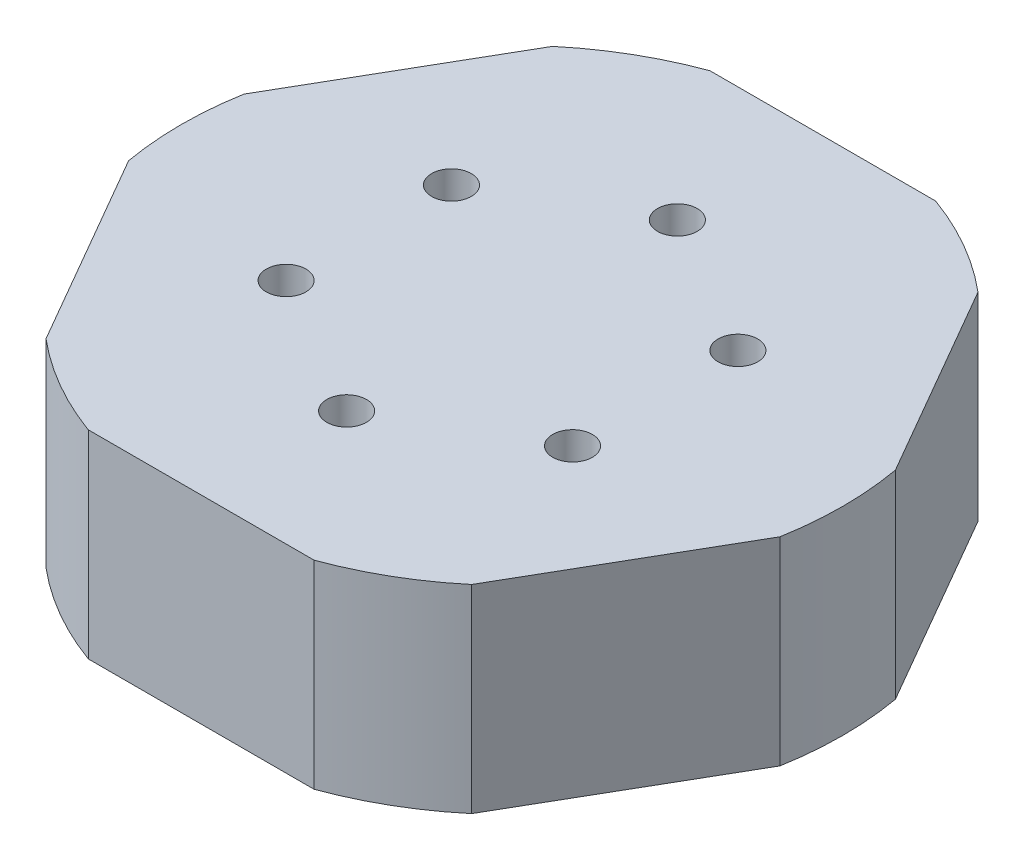
ISO-10303-21;
HEADER;
FILE_DESCRIPTION(('STEP AP214'),'2;1');
FILE_NAME('part.step','',(''),(''),'','','');
FILE_SCHEMA(('AUTOMOTIVE_DESIGN { 1 0 10303 214 1 1 1 1 }'));
ENDSEC;
DATA;
#1=APPLICATION_CONTEXT('core data for automotive mechanical design processes');
#2=APPLICATION_PROTOCOL_DEFINITION('international standard','automotive_design',2000,#1);
#3=PRODUCT_CONTEXT('',#1,'mechanical');
#4=PRODUCT('Part','Part','',(#3));
#5=PRODUCT_RELATED_PRODUCT_CATEGORY('part','',(#4));
#6=PRODUCT_DEFINITION_FORMATION('','',#4);
#7=PRODUCT_DEFINITION_CONTEXT('part definition',#1,'design');
#8=PRODUCT_DEFINITION('design','',#6,#7);
#9=PRODUCT_DEFINITION_SHAPE('','',#8);
#10=(LENGTH_UNIT() NAMED_UNIT(*) SI_UNIT(.MILLI.,.METRE.));
#11=(NAMED_UNIT(*) PLANE_ANGLE_UNIT() SI_UNIT($,.RADIAN.));
#12=(NAMED_UNIT(*) SI_UNIT($,.STERADIAN.) SOLID_ANGLE_UNIT());
#13=UNCERTAINTY_MEASURE_WITH_UNIT(LENGTH_MEASURE(1.E-05),#10,'distance_accuracy_value','');
#14=(GEOMETRIC_REPRESENTATION_CONTEXT(3) GLOBAL_UNCERTAINTY_ASSIGNED_CONTEXT((#13)) GLOBAL_UNIT_ASSIGNED_CONTEXT((#10,
#11,#12)) REPRESENTATION_CONTEXT('',''));
#15=CARTESIAN_POINT('',(0.,0.,0.));
#16=DIRECTION('',(0.,0.,1.));
#17=DIRECTION('',(1.,0.,0.));
#18=AXIS2_PLACEMENT_3D('',#15,#16,#17);
#19=CARTESIAN_POINT('',(0.,10.,0.));
#20=DIRECTION('',(0.,1.,0.));
#21=DIRECTION('',(0.,0.,1.));
#22=AXIS2_PLACEMENT_3D('',#19,#20,#21);
#23=PLANE('',#22);
#24=CARTESIAN_POINT('',(0.,10.,-25.));
#25=DIRECTION('',(0.,1.,0.));
#26=DIRECTION('',(0.,0.,1.));
#27=AXIS2_PLACEMENT_3D('',#24,#25,#26);
#28=CIRCLE('',#27,3.);
#29=CARTESIAN_POINT('',(0.,10.,-22.));
#30=VERTEX_POINT('',#29);
#31=EDGE_CURVE('E274',#30,#30,#28,.T.);
#32=ORIENTED_EDGE('',*,*,#31,.F.);
#33=EDGE_LOOP('',(#32));
#34=FACE_BOUND('',#33,.T.);
#35=CARTESIAN_POINT('',(-21.6506350946108,10.,-12.5000000000003));
#36=DIRECTION('',(0.,1.,0.));
#37=DIRECTION('',(0.,0.,1.));
#38=AXIS2_PLACEMENT_3D('',#35,#36,#37);
#39=CIRCLE('',#38,3.);
#40=CARTESIAN_POINT('',(-21.6506350946108,10.,-9.50000000000025));
#41=VERTEX_POINT('',#40);
#42=EDGE_CURVE('E265',#41,#41,#39,.T.);
#43=ORIENTED_EDGE('',*,*,#42,.F.);
#44=EDGE_LOOP('',(#43));
#45=FACE_BOUND('',#44,.T.);
#46=CARTESIAN_POINT('',(-21.6506350946111,10.,12.4999999999998));
#47=DIRECTION('',(0.,1.,0.));
#48=DIRECTION('',(0.,0.,1.));
#49=AXIS2_PLACEMENT_3D('',#46,#47,#48);
#50=CIRCLE('',#49,3.);
#51=CARTESIAN_POINT('',(-21.6506350946111,10.,15.4999999999998));
#52=VERTEX_POINT('',#51);
#53=EDGE_CURVE('E261',#52,#52,#50,.T.);
#54=ORIENTED_EDGE('',*,*,#53,.F.);
#55=EDGE_LOOP('',(#54));
#56=FACE_BOUND('',#55,.T.);
#57=CARTESIAN_POINT('',(-1.74574066942157E-13,10.,25.));
#58=DIRECTION('',(0.,1.,0.));
#59=DIRECTION('',(0.,0.,1.));
#60=AXIS2_PLACEMENT_3D('',#57,#58,#59);
#61=CIRCLE('',#60,3.);
#62=CARTESIAN_POINT('',(-1.74574066942157E-13,10.,28.));
#63=VERTEX_POINT('',#62);
#64=EDGE_CURVE('E264',#63,#63,#61,.T.);
#65=ORIENTED_EDGE('',*,*,#64,.F.);
#66=EDGE_LOOP('',(#65));
#67=FACE_BOUND('',#66,.T.);
#68=CARTESIAN_POINT('',(21.6506350946109,10.,12.5000000000001));
#69=DIRECTION('',(0.,1.,0.));
#70=DIRECTION('',(0.,0.,1.));
#71=AXIS2_PLACEMENT_3D('',#68,#69,#70);
#72=CIRCLE('',#71,3.);
#73=CARTESIAN_POINT('',(21.6506350946109,10.,15.5000000000001));
#74=VERTEX_POINT('',#73);
#75=EDGE_CURVE('E268',#74,#74,#72,.T.);
#76=ORIENTED_EDGE('',*,*,#75,.F.);
#77=EDGE_LOOP('',(#76));
#78=FACE_BOUND('',#77,.T.);
#79=CARTESIAN_POINT('',(21.650635094611,10.,-12.5));
#80=DIRECTION('',(0.,1.,0.));
#81=DIRECTION('',(0.,0.,1.));
#82=AXIS2_PLACEMENT_3D('',#79,#80,#81);
#83=CIRCLE('',#82,3.);
#84=CARTESIAN_POINT('',(21.650635094611,10.,-9.49999999999995));
#85=VERTEX_POINT('',#84);
#86=EDGE_CURVE('E271',#85,#85,#83,.T.);
#87=ORIENTED_EDGE('',*,*,#86,.F.);
#88=EDGE_LOOP('',(#87));
#89=FACE_BOUND('',#88,.T.);
#90=CARTESIAN_POINT('',(0.,10.,0.));
#91=DIRECTION('',(0.,-1.,0.));
#92=DIRECTION('',(1.,0.,0.));
#93=AXIS2_PLACEMENT_3D('',#90,#91,#92);
#94=CIRCLE('',#93,50.);
#95=CARTESIAN_POINT('',(32.1738329232526,10.,38.2732867026942));
#96=VERTEX_POINT('',#95);
#97=CARTESIAN_POINT('',(17.0587221092319,10.,47.));
#98=VERTEX_POINT('',#97);
#99=EDGE_CURVE('E167',#96,#98,#94,.T.);
#100=ORIENTED_EDGE('',*,*,#99,.F.);
#101=DIRECTION('',(0.5,0.,-0.866025403784439));
#102=VECTOR('',#101,1.);
#103=CARTESIAN_POINT('',(27.1354626519124,10.,47.));
#104=LINE('',#103,#102);
#105=CARTESIAN_POINT('',(49.2325550324846,10.,8.72671329730582));
#106=VERTEX_POINT('',#105);
#107=EDGE_CURVE('E150',#96,#106,#104,.T.);
#108=ORIENTED_EDGE('',*,*,#107,.T.);
#109=CARTESIAN_POINT('',(49.2325550324846,10.,-8.72671329730581));
#110=VERTEX_POINT('',#109);
#111=EDGE_CURVE('E157',#110,#106,#94,.T.);
#112=ORIENTED_EDGE('',*,*,#111,.F.);
#113=DIRECTION('',(-0.5,0.,-0.866025403784439));
#114=VECTOR('',#113,1.);
#115=CARTESIAN_POINT('',(54.2709253038248,10.,0.));
#116=LINE('',#115,#114);
#117=CARTESIAN_POINT('',(32.1738329232526,10.,-38.2732867026942));
#118=VERTEX_POINT('',#117);
#119=EDGE_CURVE('E141',#110,#118,#116,.T.);
#120=ORIENTED_EDGE('',*,*,#119,.T.);
#121=CARTESIAN_POINT('',(17.058722109232,10.,-47.));
#122=VERTEX_POINT('',#121);
#123=EDGE_CURVE('E164',#122,#118,#94,.T.);
#124=ORIENTED_EDGE('',*,*,#123,.F.);
#125=DIRECTION('',(-1.,0.,0.));
#126=VECTOR('',#125,1.);
#127=CARTESIAN_POINT('',(27.1354626519124,10.,-47.));
#128=LINE('',#127,#126);
#129=CARTESIAN_POINT('',(-17.058722109232,10.,-47.));
#130=VERTEX_POINT('',#129);
#131=EDGE_CURVE('E149',#122,#130,#128,.T.);
#132=ORIENTED_EDGE('',*,*,#131,.T.);
#133=CARTESIAN_POINT('',(-32.1738329232526,10.,-38.2732867026942));
#134=VERTEX_POINT('',#133);
#135=EDGE_CURVE('E168',#134,#130,#94,.T.);
#136=ORIENTED_EDGE('',*,*,#135,.F.);
#137=DIRECTION('',(-0.5,0.,0.866025403784439));
#138=VECTOR('',#137,1.);
#139=CARTESIAN_POINT('',(-27.1354626519124,10.,-47.));
#140=LINE('',#139,#138);
#141=CARTESIAN_POINT('',(-49.2325550324846,10.,-8.7267132973058));
#142=VERTEX_POINT('',#141);
#143=EDGE_CURVE('E203',#134,#142,#140,.T.);
#144=ORIENTED_EDGE('',*,*,#143,.T.);
#145=CARTESIAN_POINT('',(-49.2325550324846,10.,8.72671329730581));
#146=VERTEX_POINT('',#145);
#147=EDGE_CURVE('E182',#146,#142,#94,.T.);
#148=ORIENTED_EDGE('',*,*,#147,.F.);
#149=DIRECTION('',(0.5,0.,0.866025403784439));
#150=VECTOR('',#149,1.);
#151=CARTESIAN_POINT('',(-54.2709253038248,10.,0.));
#152=LINE('',#151,#150);
#153=CARTESIAN_POINT('',(-32.1738329232526,10.,38.2732867026942));
#154=VERTEX_POINT('',#153);
#155=EDGE_CURVE('E205',#146,#154,#152,.T.);
#156=ORIENTED_EDGE('',*,*,#155,.T.);
#157=CARTESIAN_POINT('',(-17.058722109232,10.,47.));
#158=VERTEX_POINT('',#157);
#159=EDGE_CURVE('E175',#158,#154,#94,.T.);
#160=ORIENTED_EDGE('',*,*,#159,.F.);
#161=DIRECTION('',(1.,0.,0.));
#162=VECTOR('',#161,1.);
#163=CARTESIAN_POINT('',(-27.1354626519124,10.,47.));
#164=LINE('',#163,#162);
#165=EDGE_CURVE('E211',#158,#98,#164,.T.);
#166=ORIENTED_EDGE('',*,*,#165,.T.);
#167=EDGE_LOOP('',(#100,#108,#112,#120,#124,#132,#136,#144,#148,#156,#160,#166));
#168=FACE_BOUND('',#167,.T.);
#169=ADVANCED_FACE('F52',(#34,#45,#56,#67,#78,#89,#168),#23,.T.);
#170=CARTESIAN_POINT('',(0.,10.,0.));
#171=DIRECTION('',(0.,-1.,0.));
#172=DIRECTION('',(0.,0.,-1.));
#173=AXIS2_PLACEMENT_3D('',#170,#171,#172);
#174=CYLINDRICAL_SURFACE('',#173,50.);
#175=CARTESIAN_POINT('',(0.,-20.,0.));
#176=DIRECTION('',(0.,-1.,0.));
#177=DIRECTION('',(1.,0.,0.));
#178=AXIS2_PLACEMENT_3D('',#175,#176,#177);
#179=CIRCLE('',#178,50.);
#180=CARTESIAN_POINT('',(32.1738329232527,-20.,38.2732867026941));
#181=VERTEX_POINT('',#180);
#182=CARTESIAN_POINT('',(17.0587221092319,-20.,47.));
#183=VERTEX_POINT('',#182);
#184=EDGE_CURVE('E165',#181,#183,#179,.T.);
#185=ORIENTED_EDGE('',*,*,#184,.F.);
#186=DIRECTION('',(0.,-1.,0.));
#187=VECTOR('',#186,1.);
#188=CARTESIAN_POINT('',(32.1738329232526,10.,38.2732867026942));
#189=LINE('',#188,#187);
#190=EDGE_CURVE('E230',#181,#96,#189,.F.);
#191=ORIENTED_EDGE('',*,*,#190,.T.);
#192=ORIENTED_EDGE('',*,*,#99,.T.);
#193=DIRECTION('',(0.,-1.,0.));
#194=VECTOR('',#193,1.);
#195=CARTESIAN_POINT('',(17.0587221092319,10.,47.));
#196=LINE('',#195,#194);
#197=EDGE_CURVE('E224',#98,#183,#196,.T.);
#198=ORIENTED_EDGE('',*,*,#197,.T.);
#199=EDGE_LOOP('',(#185,#191,#192,#198));
#200=FACE_BOUND('',#199,.T.);
#201=ADVANCED_FACE('F255',(#200),#174,.T.);
#202=ORIENTED_EDGE('',*,*,#111,.T.);
#203=DIRECTION('',(0.,-1.,0.));
#204=VECTOR('',#203,1.);
#205=CARTESIAN_POINT('',(49.2325550324846,10.,8.72671329730581));
#206=LINE('',#205,#204);
#207=CARTESIAN_POINT('',(49.2325550324846,-20.,8.72671329730588));
#208=VERTEX_POINT('',#207);
#209=EDGE_CURVE('E228',#106,#208,#206,.T.);
#210=ORIENTED_EDGE('',*,*,#209,.T.);
#211=CARTESIAN_POINT('',(49.2325550324846,-20.,-8.72671329730584));
#212=VERTEX_POINT('',#211);
#213=EDGE_CURVE('E159',#212,#208,#179,.T.);
#214=ORIENTED_EDGE('',*,*,#213,.F.);
#215=DIRECTION('',(0.,-1.,0.));
#216=VECTOR('',#215,1.);
#217=CARTESIAN_POINT('',(49.2325550324846,10.,-8.72671329730581));
#218=LINE('',#217,#216);
#219=EDGE_CURVE('E69',#212,#110,#218,.F.);
#220=ORIENTED_EDGE('',*,*,#219,.T.);
#221=EDGE_LOOP('',(#202,#210,#214,#220));
#222=FACE_BOUND('',#221,.T.);
#223=ADVANCED_FACE('F155',(#222),#174,.T.);
#224=CARTESIAN_POINT('',(-17.058722109232,-20.,47.));
#225=VERTEX_POINT('',#224);
#226=CARTESIAN_POINT('',(-32.1738329232526,-20.,38.2732867026941));
#227=VERTEX_POINT('',#226);
#228=EDGE_CURVE('E170',#225,#227,#179,.T.);
#229=ORIENTED_EDGE('',*,*,#228,.F.);
#230=DIRECTION('',(0.,-1.,0.));
#231=VECTOR('',#230,1.);
#232=CARTESIAN_POINT('',(-17.058722109232,10.,47.));
#233=LINE('',#232,#231);
#234=EDGE_CURVE('E226',#225,#158,#233,.F.);
#235=ORIENTED_EDGE('',*,*,#234,.T.);
#236=ORIENTED_EDGE('',*,*,#159,.T.);
#237=DIRECTION('',(0.,-1.,0.));
#238=VECTOR('',#237,1.);
#239=CARTESIAN_POINT('',(-32.1738329232526,10.,38.2732867026942));
#240=LINE('',#239,#238);
#241=EDGE_CURVE('E220',#154,#227,#240,.T.);
#242=ORIENTED_EDGE('',*,*,#241,.T.);
#243=EDGE_LOOP('',(#229,#235,#236,#242));
#244=FACE_BOUND('',#243,.T.);
#245=ADVANCED_FACE('F249',(#244),#174,.T.);
#246=CARTESIAN_POINT('',(-49.2325550324846,-20.,8.72671329730587));
#247=VERTEX_POINT('',#246);
#248=CARTESIAN_POINT('',(-49.2325550324846,-20.,-8.72671329730586));
#249=VERTEX_POINT('',#248);
#250=EDGE_CURVE('E239',#247,#249,#179,.T.);
#251=ORIENTED_EDGE('',*,*,#250,.F.);
#252=DIRECTION('',(0.,-1.,0.));
#253=VECTOR('',#252,1.);
#254=CARTESIAN_POINT('',(-49.2325550324846,10.,8.72671329730581));
#255=LINE('',#254,#253);
#256=EDGE_CURVE('E222',#247,#146,#255,.F.);
#257=ORIENTED_EDGE('',*,*,#256,.T.);
#258=ORIENTED_EDGE('',*,*,#147,.T.);
#259=DIRECTION('',(0.,-1.,0.));
#260=VECTOR('',#259,1.);
#261=CARTESIAN_POINT('',(-49.2325550324846,10.,-8.72671329730579));
#262=LINE('',#261,#260);
#263=EDGE_CURVE('E217',#142,#249,#262,.T.);
#264=ORIENTED_EDGE('',*,*,#263,.T.);
#265=EDGE_LOOP('',(#251,#257,#258,#264));
#266=FACE_BOUND('',#265,.T.);
#267=ADVANCED_FACE('F446',(#266),#174,.T.);
#268=CARTESIAN_POINT('',(-32.1738329232527,-20.,-38.2732867026941));
#269=VERTEX_POINT('',#268);
#270=CARTESIAN_POINT('',(-17.0587221092319,-20.,-47.));
#271=VERTEX_POINT('',#270);
#272=EDGE_CURVE('E237',#269,#271,#179,.T.);
#273=ORIENTED_EDGE('',*,*,#272,.F.);
#274=DIRECTION('',(0.,-1.,0.));
#275=VECTOR('',#274,1.);
#276=CARTESIAN_POINT('',(-32.1738329232526,10.,-38.2732867026942));
#277=LINE('',#276,#275);
#278=EDGE_CURVE('E200',#269,#134,#277,.F.);
#279=ORIENTED_EDGE('',*,*,#278,.T.);
#280=ORIENTED_EDGE('',*,*,#135,.T.);
#281=DIRECTION('',(0.,-1.,0.));
#282=VECTOR('',#281,1.);
#283=CARTESIAN_POINT('',(-17.058722109232,10.,-47.));
#284=LINE('',#283,#282);
#285=EDGE_CURVE('E160',#130,#271,#284,.T.);
#286=ORIENTED_EDGE('',*,*,#285,.T.);
#287=EDGE_LOOP('',(#273,#279,#280,#286));
#288=FACE_BOUND('',#287,.T.);
#289=ADVANCED_FACE('F198',(#288),#174,.T.);
#290=CARTESIAN_POINT('',(17.0587221092319,-20.,-47.));
#291=VERTEX_POINT('',#290);
#292=CARTESIAN_POINT('',(32.1738329232526,-20.,-38.2732867026942));
#293=VERTEX_POINT('',#292);
#294=EDGE_CURVE('E234',#291,#293,#179,.T.);
#295=ORIENTED_EDGE('',*,*,#294,.F.);
#296=DIRECTION('',(0.,-1.,0.));
#297=VECTOR('',#296,1.);
#298=CARTESIAN_POINT('',(17.058722109232,10.,-47.));
#299=LINE('',#298,#297);
#300=EDGE_CURVE('E77',#291,#122,#299,.F.);
#301=ORIENTED_EDGE('',*,*,#300,.T.);
#302=ORIENTED_EDGE('',*,*,#123,.T.);
#303=DIRECTION('',(0.,-1.,0.));
#304=VECTOR('',#303,1.);
#305=CARTESIAN_POINT('',(32.1738329232526,10.,-38.2732867026942));
#306=LINE('',#305,#304);
#307=EDGE_CURVE('E144',#118,#293,#306,.T.);
#308=ORIENTED_EDGE('',*,*,#307,.T.);
#309=EDGE_LOOP('',(#295,#301,#302,#308));
#310=FACE_BOUND('',#309,.T.);
#311=ADVANCED_FACE('F323',(#310),#174,.T.);
#312=CARTESIAN_POINT('',(0.,-20.,0.));
#313=DIRECTION('',(0.,-1.,0.));
#314=DIRECTION('',(0.,0.,-1.));
#315=AXIS2_PLACEMENT_3D('',#312,#313,#314);
#316=PLANE('',#315);
#317=CARTESIAN_POINT('',(0.,-20.,0.));
#318=DIRECTION('',(0.,-1.,0.));
#319=DIRECTION('',(0.,0.,-1.));
#320=AXIS2_PLACEMENT_3D('',#317,#318,#319);
#321=CIRCLE('',#320,40.);
#322=CARTESIAN_POINT('',(0.,-20.,-40.));
#323=VERTEX_POINT('',#322);
#324=EDGE_CURVE('E232',#323,#323,#321,.T.);
#325=ORIENTED_EDGE('',*,*,#324,.F.);
#326=EDGE_LOOP('',(#325));
#327=FACE_BOUND('',#326,.T.);
#328=ORIENTED_EDGE('',*,*,#213,.T.);
#329=DIRECTION('',(-0.5,0.,0.866025403784439));
#330=VECTOR('',#329,1.);
#331=CARTESIAN_POINT('',(40.7031939778686,-20.,23.5));
#332=LINE('',#331,#330);
#333=EDGE_CURVE('E13',#208,#181,#332,.T.);
#334=ORIENTED_EDGE('',*,*,#333,.T.);
#335=ORIENTED_EDGE('',*,*,#184,.T.);
#336=DIRECTION('',(-1.,0.,0.));
#337=VECTOR('',#336,1.);
#338=CARTESIAN_POINT('',(0.,-20.,47.));
#339=LINE('',#338,#337);
#340=EDGE_CURVE('E61',#183,#225,#339,.T.);
#341=ORIENTED_EDGE('',*,*,#340,.T.);
#342=ORIENTED_EDGE('',*,*,#228,.T.);
#343=DIRECTION('',(-0.5,0.,-0.866025403784439));
#344=VECTOR('',#343,1.);
#345=CARTESIAN_POINT('',(-40.7031939778686,-20.,23.5));
#346=LINE('',#345,#344);
#347=EDGE_CURVE('E248',#227,#247,#346,.T.);
#348=ORIENTED_EDGE('',*,*,#347,.T.);
#349=ORIENTED_EDGE('',*,*,#250,.T.);
#350=DIRECTION('',(0.5,0.,-0.866025403784439));
#351=VECTOR('',#350,1.);
#352=CARTESIAN_POINT('',(-40.7031939778686,-20.,-23.5));
#353=LINE('',#352,#351);
#354=EDGE_CURVE('E498',#249,#269,#353,.T.);
#355=ORIENTED_EDGE('',*,*,#354,.T.);
#356=ORIENTED_EDGE('',*,*,#272,.T.);
#357=DIRECTION('',(1.,0.,0.));
#358=VECTOR('',#357,1.);
#359=CARTESIAN_POINT('',(0.,-20.,-47.));
#360=LINE('',#359,#358);
#361=EDGE_CURVE('E499',#271,#291,#360,.T.);
#362=ORIENTED_EDGE('',*,*,#361,.T.);
#363=ORIENTED_EDGE('',*,*,#294,.T.);
#364=DIRECTION('',(0.5,0.,0.866025403784439));
#365=VECTOR('',#364,1.);
#366=CARTESIAN_POINT('',(40.7031939778686,-20.,-23.5));
#367=LINE('',#366,#365);
#368=EDGE_CURVE('E180',#293,#212,#367,.T.);
#369=ORIENTED_EDGE('',*,*,#368,.T.);
#370=EDGE_LOOP('',(#328,#334,#335,#341,#342,#348,#349,#355,#356,#362,#363,#369));
#371=FACE_BOUND('',#370,.T.);
#372=ADVANCED_FACE('F247',(#327,#371),#316,.T.);
#373=CARTESIAN_POINT('',(0.,10.,0.));
#374=DIRECTION('',(0.,-1.,0.));
#375=DIRECTION('',(0.,0.,-1.));
#376=AXIS2_PLACEMENT_3D('',#373,#374,#375);
#377=CYLINDRICAL_SURFACE('',#376,40.);
#378=ORIENTED_EDGE('',*,*,#324,.T.);
#379=EDGE_LOOP('',(#378));
#380=FACE_BOUND('',#379,.T.);
#381=CARTESIAN_POINT('',(0.,0.,0.));
#382=DIRECTION('',(0.,1.,0.));
#383=DIRECTION('',(0.,0.,1.));
#384=AXIS2_PLACEMENT_3D('',#381,#382,#383);
#385=CIRCLE('',#384,40.);
#386=CARTESIAN_POINT('',(0.,0.,40.));
#387=VERTEX_POINT('',#386);
#388=EDGE_CURVE('E174',#387,#387,#385,.T.);
#389=ORIENTED_EDGE('',*,*,#388,.T.);
#390=EDGE_LOOP('',(#389));
#391=FACE_BOUND('',#390,.T.);
#392=ADVANCED_FACE('F326',(#380,#391),#377,.F.);
#393=CARTESIAN_POINT('',(0.,0.,0.));
#394=DIRECTION('',(0.,1.,0.));
#395=DIRECTION('',(0.,0.,1.));
#396=AXIS2_PLACEMENT_3D('',#393,#394,#395);
#397=PLANE('',#396);
#398=CARTESIAN_POINT('',(0.,0.,-25.));
#399=DIRECTION('',(0.,1.,0.));
#400=DIRECTION('',(0.,0.,1.));
#401=AXIS2_PLACEMENT_3D('',#398,#399,#400);
#402=CIRCLE('',#401,3.);
#403=CARTESIAN_POINT('',(0.,0.,-22.));
#404=VERTEX_POINT('',#403);
#405=EDGE_CURVE('E56',#404,#404,#402,.T.);
#406=ORIENTED_EDGE('',*,*,#405,.T.);
#407=EDGE_LOOP('',(#406));
#408=FACE_BOUND('',#407,.T.);
#409=CARTESIAN_POINT('',(-21.6506350946108,0.,-12.5000000000003));
#410=DIRECTION('',(0.,1.,0.));
#411=DIRECTION('',(0.,0.,1.));
#412=AXIS2_PLACEMENT_3D('',#409,#410,#411);
#413=CIRCLE('',#412,3.);
#414=CARTESIAN_POINT('',(-21.6506350946108,0.,-9.50000000000025));
#415=VERTEX_POINT('',#414);
#416=EDGE_CURVE('E259',#415,#415,#413,.T.);
#417=ORIENTED_EDGE('',*,*,#416,.T.);
#418=EDGE_LOOP('',(#417));
#419=FACE_BOUND('',#418,.T.);
#420=CARTESIAN_POINT('',(-21.6506350946111,0.,12.4999999999998));
#421=DIRECTION('',(0.,1.,0.));
#422=DIRECTION('',(0.,0.,1.));
#423=AXIS2_PLACEMENT_3D('',#420,#421,#422);
#424=CIRCLE('',#423,3.);
#425=CARTESIAN_POINT('',(-21.6506350946111,0.,15.4999999999998));
#426=VERTEX_POINT('',#425);
#427=EDGE_CURVE('E293',#426,#426,#424,.T.);
#428=ORIENTED_EDGE('',*,*,#427,.T.);
#429=EDGE_LOOP('',(#428));
#430=FACE_BOUND('',#429,.T.);
#431=CARTESIAN_POINT('',(-1.74574066942157E-13,0.,25.));
#432=DIRECTION('',(0.,1.,0.));
#433=DIRECTION('',(0.,0.,1.));
#434=AXIS2_PLACEMENT_3D('',#431,#432,#433);
#435=CIRCLE('',#434,3.);
#436=CARTESIAN_POINT('',(-1.74574066942157E-13,0.,28.));
#437=VERTEX_POINT('',#436);
#438=EDGE_CURVE('E287',#437,#437,#435,.T.);
#439=ORIENTED_EDGE('',*,*,#438,.T.);
#440=EDGE_LOOP('',(#439));
#441=FACE_BOUND('',#440,.T.);
#442=CARTESIAN_POINT('',(21.6506350946109,0.,12.5000000000001));
#443=DIRECTION('',(0.,1.,0.));
#444=DIRECTION('',(0.,0.,1.));
#445=AXIS2_PLACEMENT_3D('',#442,#443,#444);
#446=CIRCLE('',#445,3.);
#447=CARTESIAN_POINT('',(21.6506350946109,0.,15.5000000000001));
#448=VERTEX_POINT('',#447);
#449=EDGE_CURVE('E282',#448,#448,#446,.T.);
#450=ORIENTED_EDGE('',*,*,#449,.T.);
#451=EDGE_LOOP('',(#450));
#452=FACE_BOUND('',#451,.T.);
#453=CARTESIAN_POINT('',(21.650635094611,0.,-12.5));
#454=DIRECTION('',(0.,1.,0.));
#455=DIRECTION('',(0.,0.,1.));
#456=AXIS2_PLACEMENT_3D('',#453,#454,#455);
#457=CIRCLE('',#456,3.);
#458=CARTESIAN_POINT('',(21.650635094611,0.,-9.49999999999995));
#459=VERTEX_POINT('',#458);
#460=EDGE_CURVE('E278',#459,#459,#457,.T.);
#461=ORIENTED_EDGE('',*,*,#460,.T.);
#462=EDGE_LOOP('',(#461));
#463=FACE_BOUND('',#462,.T.);
#464=ORIENTED_EDGE('',*,*,#388,.F.);
#465=EDGE_LOOP('',(#464));
#466=FACE_BOUND('',#465,.T.);
#467=ADVANCED_FACE('F54',(#408,#419,#430,#441,#452,#463,#466),#397,.F.);
#468=CARTESIAN_POINT('',(54.2709253038248,-20.,0.));
#469=DIRECTION('',(0.866025403784439,0.,-0.5));
#470=DIRECTION('',(-0.5,0.,-0.866025403784439));
#471=AXIS2_PLACEMENT_3D('',#468,#469,#470);
#472=PLANE('',#471);
#473=ORIENTED_EDGE('',*,*,#368,.F.);
#474=ORIENTED_EDGE('',*,*,#307,.F.);
#475=ORIENTED_EDGE('',*,*,#119,.F.);
#476=ORIENTED_EDGE('',*,*,#219,.F.);
#477=EDGE_LOOP('',(#473,#474,#475,#476));
#478=FACE_BOUND('',#477,.T.);
#479=ADVANCED_FACE('F142',(#478),#472,.T.);
#480=CARTESIAN_POINT('',(27.1354626519124,-20.,-47.));
#481=DIRECTION('',(0.,0.,-1.));
#482=DIRECTION('',(-1.,0.,0.));
#483=AXIS2_PLACEMENT_3D('',#480,#481,#482);
#484=PLANE('',#483);
#485=ORIENTED_EDGE('',*,*,#361,.F.);
#486=ORIENTED_EDGE('',*,*,#285,.F.);
#487=ORIENTED_EDGE('',*,*,#131,.F.);
#488=ORIENTED_EDGE('',*,*,#300,.F.);
#489=EDGE_LOOP('',(#485,#486,#487,#488));
#490=FACE_BOUND('',#489,.T.);
#491=ADVANCED_FACE('F337',(#490),#484,.T.);
#492=CARTESIAN_POINT('',(-27.1354626519124,-20.,-47.));
#493=DIRECTION('',(-0.866025403784439,0.,-0.5));
#494=DIRECTION('',(-0.5,0.,0.866025403784439));
#495=AXIS2_PLACEMENT_3D('',#492,#493,#494);
#496=PLANE('',#495);
#497=ORIENTED_EDGE('',*,*,#354,.F.);
#498=ORIENTED_EDGE('',*,*,#263,.F.);
#499=ORIENTED_EDGE('',*,*,#143,.F.);
#500=ORIENTED_EDGE('',*,*,#278,.F.);
#501=EDGE_LOOP('',(#497,#498,#499,#500));
#502=FACE_BOUND('',#501,.T.);
#503=ADVANCED_FACE('F340',(#502),#496,.T.);
#504=CARTESIAN_POINT('',(-54.2709253038248,-20.,0.));
#505=DIRECTION('',(-0.866025403784439,0.,0.5));
#506=DIRECTION('',(0.5,0.,0.866025403784439));
#507=AXIS2_PLACEMENT_3D('',#504,#505,#506);
#508=PLANE('',#507);
#509=ORIENTED_EDGE('',*,*,#347,.F.);
#510=ORIENTED_EDGE('',*,*,#241,.F.);
#511=ORIENTED_EDGE('',*,*,#155,.F.);
#512=ORIENTED_EDGE('',*,*,#256,.F.);
#513=EDGE_LOOP('',(#509,#510,#511,#512));
#514=FACE_BOUND('',#513,.T.);
#515=ADVANCED_FACE('F251',(#514),#508,.T.);
#516=CARTESIAN_POINT('',(-27.1354626519124,-20.,47.));
#517=DIRECTION('',(0.,0.,1.));
#518=DIRECTION('',(1.,0.,0.));
#519=AXIS2_PLACEMENT_3D('',#516,#517,#518);
#520=PLANE('',#519);
#521=ORIENTED_EDGE('',*,*,#340,.F.);
#522=ORIENTED_EDGE('',*,*,#197,.F.);
#523=ORIENTED_EDGE('',*,*,#165,.F.);
#524=ORIENTED_EDGE('',*,*,#234,.F.);
#525=EDGE_LOOP('',(#521,#522,#523,#524));
#526=FACE_BOUND('',#525,.T.);
#527=ADVANCED_FACE('F253',(#526),#520,.T.);
#528=CARTESIAN_POINT('',(27.1354626519124,-20.,47.));
#529=DIRECTION('',(0.866025403784439,0.,0.5));
#530=DIRECTION('',(0.5,0.,-0.866025403784439));
#531=AXIS2_PLACEMENT_3D('',#528,#529,#530);
#532=PLANE('',#531);
#533=ORIENTED_EDGE('',*,*,#333,.F.);
#534=ORIENTED_EDGE('',*,*,#209,.F.);
#535=ORIENTED_EDGE('',*,*,#107,.F.);
#536=ORIENTED_EDGE('',*,*,#190,.F.);
#537=EDGE_LOOP('',(#533,#534,#535,#536));
#538=FACE_BOUND('',#537,.T.);
#539=ADVANCED_FACE('F257',(#538),#532,.T.);
#540=CARTESIAN_POINT('',(21.650635094611,-20.,-12.5));
#541=DIRECTION('',(0.,1.,0.));
#542=DIRECTION('',(0.,0.,1.));
#543=AXIS2_PLACEMENT_3D('',#540,#541,#542);
#544=CYLINDRICAL_SURFACE('',#543,3.);
#545=ORIENTED_EDGE('',*,*,#86,.T.);
#546=EDGE_LOOP('',(#545));
#547=FACE_BOUND('',#546,.T.);
#548=ORIENTED_EDGE('',*,*,#460,.F.);
#549=EDGE_LOOP('',(#548));
#550=FACE_BOUND('',#549,.T.);
#551=ADVANCED_FACE('F334',(#547,#550),#544,.F.);
#552=CARTESIAN_POINT('',(21.6506350946109,-20.,12.5000000000001));
#553=DIRECTION('',(0.,1.,0.));
#554=DIRECTION('',(0.,0.,1.));
#555=AXIS2_PLACEMENT_3D('',#552,#553,#554);
#556=CYLINDRICAL_SURFACE('',#555,3.);
#557=ORIENTED_EDGE('',*,*,#75,.T.);
#558=EDGE_LOOP('',(#557));
#559=FACE_BOUND('',#558,.T.);
#560=ORIENTED_EDGE('',*,*,#449,.F.);
#561=EDGE_LOOP('',(#560));
#562=FACE_BOUND('',#561,.T.);
#563=ADVANCED_FACE('F350',(#559,#562),#556,.F.);
#564=CARTESIAN_POINT('',(-1.74574066942157E-13,-20.,25.));
#565=DIRECTION('',(0.,1.,0.));
#566=DIRECTION('',(0.,0.,1.));
#567=AXIS2_PLACEMENT_3D('',#564,#565,#566);
#568=CYLINDRICAL_SURFACE('',#567,3.);
#569=ORIENTED_EDGE('',*,*,#64,.T.);
#570=EDGE_LOOP('',(#569));
#571=FACE_BOUND('',#570,.T.);
#572=ORIENTED_EDGE('',*,*,#438,.F.);
#573=EDGE_LOOP('',(#572));
#574=FACE_BOUND('',#573,.T.);
#575=ADVANCED_FACE('F311',(#571,#574),#568,.F.);
#576=CARTESIAN_POINT('',(-21.6506350946111,-20.,12.4999999999998));
#577=DIRECTION('',(0.,1.,0.));
#578=DIRECTION('',(0.,0.,1.));
#579=AXIS2_PLACEMENT_3D('',#576,#577,#578);
#580=CYLINDRICAL_SURFACE('',#579,3.);
#581=ORIENTED_EDGE('',*,*,#53,.T.);
#582=EDGE_LOOP('',(#581));
#583=FACE_BOUND('',#582,.T.);
#584=ORIENTED_EDGE('',*,*,#427,.F.);
#585=EDGE_LOOP('',(#584));
#586=FACE_BOUND('',#585,.T.);
#587=ADVANCED_FACE('F303',(#583,#586),#580,.F.);
#588=CARTESIAN_POINT('',(-21.6506350946108,-20.,-12.5000000000003));
#589=DIRECTION('',(0.,1.,0.));
#590=DIRECTION('',(0.,0.,1.));
#591=AXIS2_PLACEMENT_3D('',#588,#589,#590);
#592=CYLINDRICAL_SURFACE('',#591,3.);
#593=ORIENTED_EDGE('',*,*,#42,.T.);
#594=EDGE_LOOP('',(#593));
#595=FACE_BOUND('',#594,.T.);
#596=ORIENTED_EDGE('',*,*,#416,.F.);
#597=EDGE_LOOP('',(#596));
#598=FACE_BOUND('',#597,.T.);
#599=ADVANCED_FACE('F300',(#595,#598),#592,.F.);
#600=CARTESIAN_POINT('',(0.,-20.,-25.));
#601=DIRECTION('',(0.,1.,0.));
#602=DIRECTION('',(0.,0.,1.));
#603=AXIS2_PLACEMENT_3D('',#600,#601,#602);
#604=CYLINDRICAL_SURFACE('',#603,3.);
#605=ORIENTED_EDGE('',*,*,#31,.T.);
#606=EDGE_LOOP('',(#605));
#607=FACE_BOUND('',#606,.T.);
#608=ORIENTED_EDGE('',*,*,#405,.F.);
#609=EDGE_LOOP('',(#608));
#610=FACE_BOUND('',#609,.T.);
#611=ADVANCED_FACE('F302',(#607,#610),#604,.F.);
#612=CLOSED_SHELL('',(#169,#201,#223,#245,#267,#289,#311,#372,#392,#467,#479,#491,#503,#515,
#527,#539,#551,#563,#575,#587,#599,#611));
#613=MANIFOLD_SOLID_BREP('B2',#612);
#614=ADVANCED_BREP_SHAPE_REPRESENTATION('',(#18,#613),#14);
#615=SHAPE_DEFINITION_REPRESENTATION(#9,#614);
ENDSEC;
END-ISO-10303-21;
